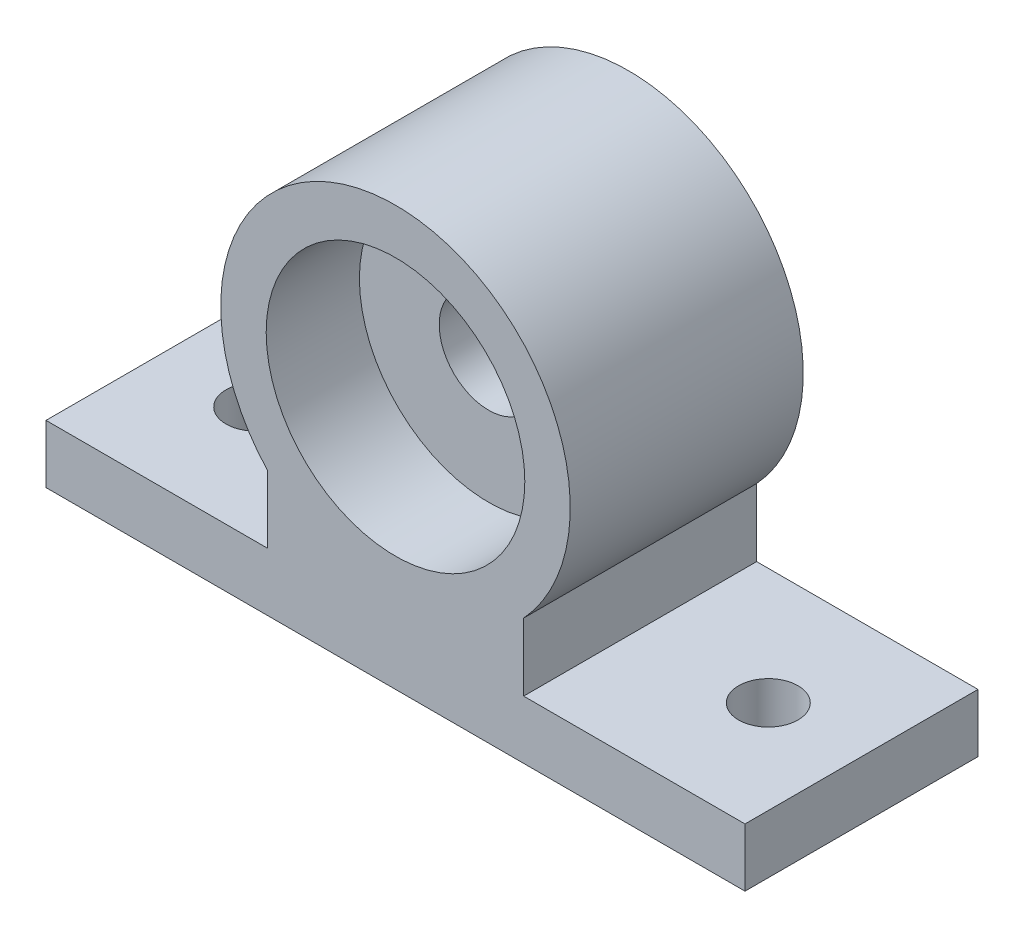
ISO-10303-21;
HEADER;
FILE_DESCRIPTION(('STEP AP214'),'2;1');
FILE_NAME('part.step','',(''),(''),'','','');
FILE_SCHEMA(('AUTOMOTIVE_DESIGN { 1 0 10303 214 1 1 1 1 }'));
ENDSEC;
DATA;
#1=APPLICATION_CONTEXT('core data for automotive mechanical design processes');
#2=APPLICATION_PROTOCOL_DEFINITION('international standard','automotive_design',2000,#1);
#3=PRODUCT_CONTEXT('',#1,'mechanical');
#4=PRODUCT('Part','Part','',(#3));
#5=PRODUCT_RELATED_PRODUCT_CATEGORY('part','',(#4));
#6=PRODUCT_DEFINITION_FORMATION('','',#4);
#7=PRODUCT_DEFINITION_CONTEXT('part definition',#1,'design');
#8=PRODUCT_DEFINITION('design','',#6,#7);
#9=PRODUCT_DEFINITION_SHAPE('','',#8);
#10=(LENGTH_UNIT() NAMED_UNIT(*) SI_UNIT(.MILLI.,.METRE.));
#11=(NAMED_UNIT(*) PLANE_ANGLE_UNIT() SI_UNIT($,.RADIAN.));
#12=(NAMED_UNIT(*) SI_UNIT($,.STERADIAN.) SOLID_ANGLE_UNIT());
#13=UNCERTAINTY_MEASURE_WITH_UNIT(LENGTH_MEASURE(1.E-05),#10,'distance_accuracy_value','');
#14=(GEOMETRIC_REPRESENTATION_CONTEXT(3) GLOBAL_UNCERTAINTY_ASSIGNED_CONTEXT((#13)) GLOBAL_UNIT_ASSIGNED_CONTEXT((#10,
#11,#12)) REPRESENTATION_CONTEXT('',''));
#15=CARTESIAN_POINT('',(0.,0.,0.));
#16=DIRECTION('',(0.,0.,1.));
#17=DIRECTION('',(1.,0.,0.));
#18=AXIS2_PLACEMENT_3D('',#15,#16,#17);
#19=CARTESIAN_POINT('',(9.94764397905758,21.,-5.49738219895282));
#20=DIRECTION('',(0.,0.,1.));
#21=DIRECTION('',(1.,0.,0.));
#22=AXIS2_PLACEMENT_3D('',#19,#20,#21);
#23=CYLINDRICAL_SURFACE('',#22,4.25);
#24=CARTESIAN_POINT('',(9.94764397905758,21.,-5.49738219895282));
#25=DIRECTION('',(0.,0.,1.));
#26=DIRECTION('',(1.,0.,0.));
#27=AXIS2_PLACEMENT_3D('',#24,#25,#26);
#28=CIRCLE('',#27,4.25);
#29=CARTESIAN_POINT('',(14.1976439790576,21.,-5.49738219895282));
#30=VERTEX_POINT('',#29);
#31=EDGE_CURVE('E228',#30,#30,#28,.T.);
#32=ORIENTED_EDGE('',*,*,#31,.F.);
#33=EDGE_LOOP('',(#32));
#34=FACE_BOUND('',#33,.T.);
#35=CARTESIAN_POINT('',(9.94764397905758,21.,6.50261780104718));
#36=DIRECTION('',(0.,0.,1.));
#37=DIRECTION('',(1.,0.,0.));
#38=AXIS2_PLACEMENT_3D('',#35,#36,#37);
#39=CIRCLE('',#38,4.25);
#40=CARTESIAN_POINT('',(14.1976439790576,21.,6.50261780104718));
#41=VERTEX_POINT('',#40);
#42=EDGE_CURVE('E43',#41,#41,#39,.F.);
#43=ORIENTED_EDGE('',*,*,#42,.F.);
#44=EDGE_LOOP('',(#43));
#45=FACE_BOUND('',#44,.T.);
#46=ADVANCED_FACE('F39',(#34,#45),#23,.F.);
#47=CARTESIAN_POINT('',(0.,5.,0.));
#48=DIRECTION('',(0.,1.,0.));
#49=DIRECTION('',(0.,0.,1.));
#50=AXIS2_PLACEMENT_3D('',#47,#48,#49);
#51=PLANE('',#50);
#52=DIRECTION('',(0.,0.,1.));
#53=VECTOR('',#52,1.);
#54=CARTESIAN_POINT('',(-1.05235602094243,5.,-5.49738219895282));
#55=LINE('',#54,#53);
#56=CARTESIAN_POINT('',(-1.05235602094243,5.,-5.49738219895282));
#57=VERTEX_POINT('',#56);
#58=CARTESIAN_POINT('',(-1.05235602094242,5.,14.5026178010472));
#59=VERTEX_POINT('',#58);
#60=EDGE_CURVE('E133',#57,#59,#55,.T.);
#61=ORIENTED_EDGE('',*,*,#60,.F.);
#62=DIRECTION('',(-1.,0.,0.));
#63=VECTOR('',#62,1.);
#64=CARTESIAN_POINT('',(-20.0523560209424,5.,-5.49738219895282));
#65=LINE('',#64,#63);
#66=CARTESIAN_POINT('',(-20.0523560209424,5.,-5.49738219895282));
#67=VERTEX_POINT('',#66);
#68=EDGE_CURVE('E128',#57,#67,#65,.T.);
#69=ORIENTED_EDGE('',*,*,#68,.T.);
#70=DIRECTION('',(0.,0.,1.));
#71=VECTOR('',#70,1.);
#72=CARTESIAN_POINT('',(-20.0523560209424,5.,-5.49738219895282));
#73=LINE('',#72,#71);
#74=CARTESIAN_POINT('',(-20.0523560209424,5.,14.5026178010472));
#75=VERTEX_POINT('',#74);
#76=EDGE_CURVE('E162',#67,#75,#73,.T.);
#77=ORIENTED_EDGE('',*,*,#76,.T.);
#78=DIRECTION('',(1.,0.,0.));
#79=VECTOR('',#78,1.);
#80=CARTESIAN_POINT('',(-20.0523560209424,5.,14.5026178010472));
#81=LINE('',#80,#79);
#82=EDGE_CURVE('E168',#75,#59,#81,.T.);
#83=ORIENTED_EDGE('',*,*,#82,.T.);
#84=EDGE_LOOP('',(#61,#69,#77,#83));
#85=FACE_BOUND('',#84,.T.);
#86=CARTESIAN_POINT('',(-12.0523560209424,5.,4.50261780104718));
#87=DIRECTION('',(0.,1.,0.));
#88=DIRECTION('',(0.,0.,1.));
#89=AXIS2_PLACEMENT_3D('',#86,#87,#88);
#90=CIRCLE('',#89,2.55);
#91=CARTESIAN_POINT('',(-12.0523560209424,5.,7.05261780104718));
#92=VERTEX_POINT('',#91);
#93=EDGE_CURVE('E154',#92,#92,#90,.T.);
#94=ORIENTED_EDGE('',*,*,#93,.F.);
#95=EDGE_LOOP('',(#94));
#96=FACE_BOUND('',#95,.T.);
#97=ADVANCED_FACE('F215',(#85,#96),#51,.T.);
#98=DIRECTION('',(0.,0.,-1.));
#99=VECTOR('',#98,1.);
#100=CARTESIAN_POINT('',(20.9476439790576,5.,-5.49738219895282));
#101=LINE('',#100,#99);
#102=CARTESIAN_POINT('',(20.9476439790576,5.,14.5026178010472));
#103=VERTEX_POINT('',#102);
#104=CARTESIAN_POINT('',(20.9476439790576,5.,-5.49738219895282));
#105=VERTEX_POINT('',#104);
#106=EDGE_CURVE('E121',#103,#105,#101,.T.);
#107=ORIENTED_EDGE('',*,*,#106,.F.);
#108=CARTESIAN_POINT('',(39.9476439790576,5.,14.5026178010472));
#109=VERTEX_POINT('',#108);
#110=EDGE_CURVE('E166',#103,#109,#81,.T.);
#111=ORIENTED_EDGE('',*,*,#110,.T.);
#112=DIRECTION('',(0.,0.,-1.));
#113=VECTOR('',#112,1.);
#114=CARTESIAN_POINT('',(39.9476439790576,5.,-5.49738219895282));
#115=LINE('',#114,#113);
#116=CARTESIAN_POINT('',(39.9476439790576,5.,-5.49738219895282));
#117=VERTEX_POINT('',#116);
#118=EDGE_CURVE('E124',#109,#117,#115,.T.);
#119=ORIENTED_EDGE('',*,*,#118,.T.);
#120=EDGE_CURVE('E107',#117,#105,#65,.T.);
#121=ORIENTED_EDGE('',*,*,#120,.T.);
#122=EDGE_LOOP('',(#107,#111,#119,#121));
#123=FACE_BOUND('',#122,.T.);
#124=CARTESIAN_POINT('',(31.9476439790576,5.,4.50261780104718));
#125=DIRECTION('',(0.,1.,0.));
#126=DIRECTION('',(0.,0.,1.));
#127=AXIS2_PLACEMENT_3D('',#124,#125,#126);
#128=CIRCLE('',#127,2.55);
#129=CARTESIAN_POINT('',(31.9476439790576,5.,7.05261780104717));
#130=VERTEX_POINT('',#129);
#131=EDGE_CURVE('E146',#130,#130,#128,.T.);
#132=ORIENTED_EDGE('',*,*,#131,.F.);
#133=EDGE_LOOP('',(#132));
#134=FACE_BOUND('',#133,.T.);
#135=ADVANCED_FACE('F119',(#123,#134),#51,.T.);
#136=CARTESIAN_POINT('',(0.,0.,0.));
#137=DIRECTION('',(0.,1.,0.));
#138=DIRECTION('',(0.,0.,1.));
#139=AXIS2_PLACEMENT_3D('',#136,#137,#138);
#140=PLANE('',#139);
#141=DIRECTION('',(0.,0.,1.));
#142=VECTOR('',#141,1.);
#143=CARTESIAN_POINT('',(-20.0523560209424,0.,-5.49738219895282));
#144=LINE('',#143,#142);
#145=CARTESIAN_POINT('',(-20.0523560209424,0.,-5.49738219895282));
#146=VERTEX_POINT('',#145);
#147=CARTESIAN_POINT('',(-20.0523560209424,0.,14.5026178010472));
#148=VERTEX_POINT('',#147);
#149=EDGE_CURVE('E158',#146,#148,#144,.T.);
#150=ORIENTED_EDGE('',*,*,#149,.F.);
#151=DIRECTION('',(-1.,0.,0.));
#152=VECTOR('',#151,1.);
#153=CARTESIAN_POINT('',(-20.0523560209424,0.,-5.49738219895282));
#154=LINE('',#153,#152);
#155=CARTESIAN_POINT('',(39.9476439790576,0.,-5.49738219895282));
#156=VERTEX_POINT('',#155);
#157=EDGE_CURVE('E167',#156,#146,#154,.T.);
#158=ORIENTED_EDGE('',*,*,#157,.F.);
#159=DIRECTION('',(0.,0.,-1.));
#160=VECTOR('',#159,1.);
#161=CARTESIAN_POINT('',(39.9476439790576,0.,-5.49738219895282));
#162=LINE('',#161,#160);
#163=CARTESIAN_POINT('',(39.9476439790576,0.,14.5026178010472));
#164=VERTEX_POINT('',#163);
#165=EDGE_CURVE('E180',#164,#156,#162,.T.);
#166=ORIENTED_EDGE('',*,*,#165,.F.);
#167=DIRECTION('',(1.,0.,0.));
#168=VECTOR('',#167,1.);
#169=CARTESIAN_POINT('',(-20.0523560209424,0.,14.5026178010472));
#170=LINE('',#169,#168);
#171=EDGE_CURVE('E177',#148,#164,#170,.T.);
#172=ORIENTED_EDGE('',*,*,#171,.F.);
#173=EDGE_LOOP('',(#150,#158,#166,#172));
#174=FACE_BOUND('',#173,.T.);
#175=CARTESIAN_POINT('',(-12.0523560209424,0.,4.50261780104718));
#176=DIRECTION('',(0.,1.,0.));
#177=DIRECTION('',(0.,0.,1.));
#178=AXIS2_PLACEMENT_3D('',#175,#176,#177);
#179=CIRCLE('',#178,2.55);
#180=CARTESIAN_POINT('',(-12.0523560209424,0.,7.05261780104718));
#181=VERTEX_POINT('',#180);
#182=EDGE_CURVE('E150',#181,#181,#179,.T.);
#183=ORIENTED_EDGE('',*,*,#182,.T.);
#184=EDGE_LOOP('',(#183));
#185=FACE_BOUND('',#184,.T.);
#186=CARTESIAN_POINT('',(31.9476439790576,0.,4.50261780104718));
#187=DIRECTION('',(0.,1.,0.));
#188=DIRECTION('',(0.,0.,1.));
#189=AXIS2_PLACEMENT_3D('',#186,#187,#188);
#190=CIRCLE('',#189,2.55);
#191=CARTESIAN_POINT('',(31.9476439790576,0.,7.05261780104717));
#192=VERTEX_POINT('',#191);
#193=EDGE_CURVE('E145',#192,#192,#190,.T.);
#194=ORIENTED_EDGE('',*,*,#193,.T.);
#195=EDGE_LOOP('',(#194));
#196=FACE_BOUND('',#195,.T.);
#197=ADVANCED_FACE('F207',(#174,#185,#196),#140,.F.);
#198=CARTESIAN_POINT('',(-20.0523560209424,5.,-5.49738219895282));
#199=DIRECTION('',(1.,0.,0.));
#200=DIRECTION('',(0.,0.,-1.));
#201=AXIS2_PLACEMENT_3D('',#198,#199,#200);
#202=PLANE('',#201);
#203=ORIENTED_EDGE('',*,*,#149,.T.);
#204=DIRECTION('',(0.,-1.,0.));
#205=VECTOR('',#204,1.);
#206=CARTESIAN_POINT('',(-20.0523560209424,5.,14.5026178010472));
#207=LINE('',#206,#205);
#208=EDGE_CURVE('E49',#75,#148,#207,.T.);
#209=ORIENTED_EDGE('',*,*,#208,.F.);
#210=ORIENTED_EDGE('',*,*,#76,.F.);
#211=DIRECTION('',(0.,-1.,0.));
#212=VECTOR('',#211,1.);
#213=CARTESIAN_POINT('',(-20.0523560209424,5.,-5.49738219895282));
#214=LINE('',#213,#212);
#215=EDGE_CURVE('E127',#67,#146,#214,.T.);
#216=ORIENTED_EDGE('',*,*,#215,.T.);
#217=EDGE_LOOP('',(#203,#209,#210,#216));
#218=FACE_BOUND('',#217,.T.);
#219=ADVANCED_FACE('F41',(#218),#202,.F.);
#220=CARTESIAN_POINT('',(-20.0523560209424,5.,14.5026178010472));
#221=DIRECTION('',(0.,0.,-1.));
#222=DIRECTION('',(-1.,0.,0.));
#223=AXIS2_PLACEMENT_3D('',#220,#221,#222);
#224=PLANE('',#223);
#225=CARTESIAN_POINT('',(9.94764397905758,21.,14.5026178010472));
#226=DIRECTION('',(0.,0.,1.));
#227=DIRECTION('',(1.,0.,0.));
#228=AXIS2_PLACEMENT_3D('',#225,#226,#227);
#229=CIRCLE('',#228,11.1);
#230=CARTESIAN_POINT('',(21.0476439790576,21.,14.5026178010472));
#231=VERTEX_POINT('',#230);
#232=EDGE_CURVE('E234',#231,#231,#229,.T.);
#233=ORIENTED_EDGE('',*,*,#232,.F.);
#234=EDGE_LOOP('',(#233));
#235=FACE_BOUND('',#234,.T.);
#236=DIRECTION('',(0.,-1.,0.));
#237=VECTOR('',#236,1.);
#238=CARTESIAN_POINT('',(20.9476439790576,21.,14.5026178010472));
#239=LINE('',#238,#237);
#240=CARTESIAN_POINT('',(20.9476439790576,10.8019609728144,14.5026178010472));
#241=VERTEX_POINT('',#240);
#242=EDGE_CURVE('E114',#241,#103,#239,.T.);
#243=ORIENTED_EDGE('',*,*,#242,.F.);
#244=CARTESIAN_POINT('',(9.94764397905758,21.,14.5026178010472));
#245=DIRECTION('',(0.,0.,-1.));
#246=DIRECTION('',(-1.,0.,0.));
#247=AXIS2_PLACEMENT_3D('',#244,#245,#246);
#248=CIRCLE('',#247,15.);
#249=CARTESIAN_POINT('',(-1.05235602094242,10.8019609728144,14.5026178010472));
#250=VERTEX_POINT('',#249);
#251=EDGE_CURVE('E221',#241,#250,#248,.F.);
#252=ORIENTED_EDGE('',*,*,#251,.T.);
#253=DIRECTION('',(0.,-1.,0.));
#254=VECTOR('',#253,1.);
#255=CARTESIAN_POINT('',(-1.05235602094242,21.,14.5026178010472));
#256=LINE('',#255,#254);
#257=EDGE_CURVE('E61',#250,#59,#256,.T.);
#258=ORIENTED_EDGE('',*,*,#257,.T.);
#259=ORIENTED_EDGE('',*,*,#82,.F.);
#260=ORIENTED_EDGE('',*,*,#208,.T.);
#261=ORIENTED_EDGE('',*,*,#171,.T.);
#262=DIRECTION('',(0.,-1.,0.));
#263=VECTOR('',#262,1.);
#264=CARTESIAN_POINT('',(39.9476439790576,5.,14.5026178010472));
#265=LINE('',#264,#263);
#266=EDGE_CURVE('E191',#109,#164,#265,.T.);
#267=ORIENTED_EDGE('',*,*,#266,.F.);
#268=ORIENTED_EDGE('',*,*,#110,.F.);
#269=EDGE_LOOP('',(#243,#252,#258,#259,#260,#261,#267,#268));
#270=FACE_BOUND('',#269,.T.);
#271=ADVANCED_FACE('F199',(#235,#270),#224,.F.);
#272=CARTESIAN_POINT('',(39.9476439790576,5.,-5.49738219895282));
#273=DIRECTION('',(-1.,0.,0.));
#274=DIRECTION('',(0.,0.,1.));
#275=AXIS2_PLACEMENT_3D('',#272,#273,#274);
#276=PLANE('',#275);
#277=ORIENTED_EDGE('',*,*,#165,.T.);
#278=DIRECTION('',(0.,-1.,0.));
#279=VECTOR('',#278,1.);
#280=CARTESIAN_POINT('',(39.9476439790576,5.,-5.49738219895282));
#281=LINE('',#280,#279);
#282=EDGE_CURVE('E188',#117,#156,#281,.T.);
#283=ORIENTED_EDGE('',*,*,#282,.F.);
#284=ORIENTED_EDGE('',*,*,#118,.F.);
#285=ORIENTED_EDGE('',*,*,#266,.T.);
#286=EDGE_LOOP('',(#277,#283,#284,#285));
#287=FACE_BOUND('',#286,.T.);
#288=ADVANCED_FACE('F211',(#287),#276,.F.);
#289=CARTESIAN_POINT('',(-20.0523560209424,5.,-5.49738219895282));
#290=DIRECTION('',(0.,0.,1.));
#291=DIRECTION('',(1.,0.,0.));
#292=AXIS2_PLACEMENT_3D('',#289,#290,#291);
#293=PLANE('',#292);
#294=ORIENTED_EDGE('',*,*,#31,.T.);
#295=EDGE_LOOP('',(#294));
#296=FACE_BOUND('',#295,.T.);
#297=DIRECTION('',(0.,-1.,0.));
#298=VECTOR('',#297,1.);
#299=CARTESIAN_POINT('',(-1.05235602094243,21.,-5.49738219895282));
#300=LINE('',#299,#298);
#301=CARTESIAN_POINT('',(-1.05235602094243,10.8019609728144,-5.49738219895282));
#302=VERTEX_POINT('',#301);
#303=EDGE_CURVE('E115',#302,#57,#300,.T.);
#304=ORIENTED_EDGE('',*,*,#303,.F.);
#305=CARTESIAN_POINT('',(9.94764397905758,21.,-5.49738219895282));
#306=DIRECTION('',(0.,0.,-1.));
#307=DIRECTION('',(-1.,0.,0.));
#308=AXIS2_PLACEMENT_3D('',#305,#306,#307);
#309=CIRCLE('',#308,15.);
#310=CARTESIAN_POINT('',(20.9476439790576,10.8019609728144,-5.49738219895282));
#311=VERTEX_POINT('',#310);
#312=EDGE_CURVE('E109',#302,#311,#309,.T.);
#313=ORIENTED_EDGE('',*,*,#312,.T.);
#314=DIRECTION('',(0.,-1.,0.));
#315=VECTOR('',#314,1.);
#316=CARTESIAN_POINT('',(20.9476439790576,21.,-5.49738219895282));
#317=LINE('',#316,#315);
#318=EDGE_CURVE('E103',#311,#105,#317,.T.);
#319=ORIENTED_EDGE('',*,*,#318,.T.);
#320=ORIENTED_EDGE('',*,*,#120,.F.);
#321=ORIENTED_EDGE('',*,*,#282,.T.);
#322=ORIENTED_EDGE('',*,*,#157,.T.);
#323=ORIENTED_EDGE('',*,*,#215,.F.);
#324=ORIENTED_EDGE('',*,*,#68,.F.);
#325=EDGE_LOOP('',(#304,#313,#319,#320,#321,#322,#323,#324));
#326=FACE_BOUND('',#325,.T.);
#327=ADVANCED_FACE('F105',(#296,#326),#293,.F.);
#328=CARTESIAN_POINT('',(-12.0523560209424,5.,4.50261780104718));
#329=DIRECTION('',(0.,-1.,0.));
#330=DIRECTION('',(0.,0.,-1.));
#331=AXIS2_PLACEMENT_3D('',#328,#329,#330);
#332=CYLINDRICAL_SURFACE('',#331,2.55);
#333=ORIENTED_EDGE('',*,*,#93,.T.);
#334=EDGE_LOOP('',(#333));
#335=FACE_BOUND('',#334,.T.);
#336=ORIENTED_EDGE('',*,*,#182,.F.);
#337=EDGE_LOOP('',(#336));
#338=FACE_BOUND('',#337,.T.);
#339=ADVANCED_FACE('F271',(#335,#338),#332,.F.);
#340=CARTESIAN_POINT('',(31.9476439790576,5.,4.50261780104718));
#341=DIRECTION('',(0.,-1.,0.));
#342=DIRECTION('',(0.,0.,-1.));
#343=AXIS2_PLACEMENT_3D('',#340,#341,#342);
#344=CYLINDRICAL_SURFACE('',#343,2.55);
#345=ORIENTED_EDGE('',*,*,#131,.T.);
#346=EDGE_LOOP('',(#345));
#347=FACE_BOUND('',#346,.T.);
#348=ORIENTED_EDGE('',*,*,#193,.F.);
#349=EDGE_LOOP('',(#348));
#350=FACE_BOUND('',#349,.T.);
#351=ADVANCED_FACE('F268',(#347,#350),#344,.F.);
#352=CARTESIAN_POINT('',(-1.05235602094243,21.,-5.49738219895282));
#353=DIRECTION('',(1.,0.,0.));
#354=DIRECTION('',(0.,0.,-1.));
#355=AXIS2_PLACEMENT_3D('',#352,#353,#354);
#356=PLANE('',#355);
#357=ORIENTED_EDGE('',*,*,#257,.F.);
#358=DIRECTION('',(0.,0.,-1.));
#359=VECTOR('',#358,1.);
#360=CARTESIAN_POINT('',(-1.05235602094242,10.8019609728144,56.92902467224));
#361=LINE('',#360,#359);
#362=EDGE_CURVE('E56',#250,#302,#361,.T.);
#363=ORIENTED_EDGE('',*,*,#362,.T.);
#364=ORIENTED_EDGE('',*,*,#303,.T.);
#365=ORIENTED_EDGE('',*,*,#60,.T.);
#366=EDGE_LOOP('',(#357,#363,#364,#365));
#367=FACE_BOUND('',#366,.T.);
#368=ADVANCED_FACE('F265',(#367),#356,.F.);
#369=CARTESIAN_POINT('',(20.9476439790576,21.,-5.49738219895282));
#370=DIRECTION('',(-1.,0.,0.));
#371=DIRECTION('',(0.,0.,1.));
#372=AXIS2_PLACEMENT_3D('',#369,#370,#371);
#373=PLANE('',#372);
#374=ORIENTED_EDGE('',*,*,#318,.F.);
#375=DIRECTION('',(0.,0.,-1.));
#376=VECTOR('',#375,1.);
#377=CARTESIAN_POINT('',(20.9476439790576,10.8019609728144,56.92902467224));
#378=LINE('',#377,#376);
#379=EDGE_CURVE('E11',#311,#241,#378,.F.);
#380=ORIENTED_EDGE('',*,*,#379,.T.);
#381=ORIENTED_EDGE('',*,*,#242,.T.);
#382=ORIENTED_EDGE('',*,*,#106,.T.);
#383=EDGE_LOOP('',(#374,#380,#381,#382));
#384=FACE_BOUND('',#383,.T.);
#385=ADVANCED_FACE('F130',(#384),#373,.F.);
#386=CARTESIAN_POINT('',(9.94764397905758,21.,56.92902467224));
#387=DIRECTION('',(0.,0.,-1.));
#388=DIRECTION('',(-1.,0.,0.));
#389=AXIS2_PLACEMENT_3D('',#386,#387,#388);
#390=CYLINDRICAL_SURFACE('',#389,15.);
#391=ORIENTED_EDGE('',*,*,#362,.F.);
#392=ORIENTED_EDGE('',*,*,#251,.F.);
#393=ORIENTED_EDGE('',*,*,#379,.F.);
#394=ORIENTED_EDGE('',*,*,#312,.F.);
#395=EDGE_LOOP('',(#391,#392,#393,#394));
#396=FACE_BOUND('',#395,.T.);
#397=ADVANCED_FACE('F223',(#396),#390,.T.);
#398=CARTESIAN_POINT('',(9.94764397905758,21.,6.50261780104718));
#399=DIRECTION('',(0.,0.,1.));
#400=DIRECTION('',(1.,0.,0.));
#401=AXIS2_PLACEMENT_3D('',#398,#399,#400);
#402=PLANE('',#401);
#403=CARTESIAN_POINT('',(9.94764397905758,21.,6.50261780104718));
#404=DIRECTION('',(0.,0.,1.));
#405=DIRECTION('',(1.,0.,0.));
#406=AXIS2_PLACEMENT_3D('',#403,#404,#405);
#407=CIRCLE('',#406,11.1);
#408=CARTESIAN_POINT('',(21.0476439790576,21.,6.50261780104718));
#409=VERTEX_POINT('',#408);
#410=EDGE_CURVE('E238',#409,#409,#407,.T.);
#411=ORIENTED_EDGE('',*,*,#410,.T.);
#412=EDGE_LOOP('',(#411));
#413=FACE_BOUND('',#412,.T.);
#414=ORIENTED_EDGE('',*,*,#42,.T.);
#415=EDGE_LOOP('',(#414));
#416=FACE_BOUND('',#415,.T.);
#417=ADVANCED_FACE('F247',(#413,#416),#402,.T.);
#418=CARTESIAN_POINT('',(9.94764397905758,21.,6.50261780104718));
#419=DIRECTION('',(0.,0.,1.));
#420=DIRECTION('',(1.,0.,0.));
#421=AXIS2_PLACEMENT_3D('',#418,#419,#420);
#422=CYLINDRICAL_SURFACE('',#421,11.1);
#423=ORIENTED_EDGE('',*,*,#410,.F.);
#424=EDGE_LOOP('',(#423));
#425=FACE_BOUND('',#424,.T.);
#426=ORIENTED_EDGE('',*,*,#232,.T.);
#427=EDGE_LOOP('',(#426));
#428=FACE_BOUND('',#427,.T.);
#429=ADVANCED_FACE('F259',(#425,#428),#422,.F.);
#430=CLOSED_SHELL('',(#46,#97,#135,#197,#219,#271,#288,#327,#339,#351,#368,#385,#397,#417,#429));
#431=MANIFOLD_SOLID_BREP('B2',#430);
#432=ADVANCED_BREP_SHAPE_REPRESENTATION('',(#18,#431),#14);
#433=SHAPE_DEFINITION_REPRESENTATION(#9,#432);
ENDSEC;
END-ISO-10303-21;
